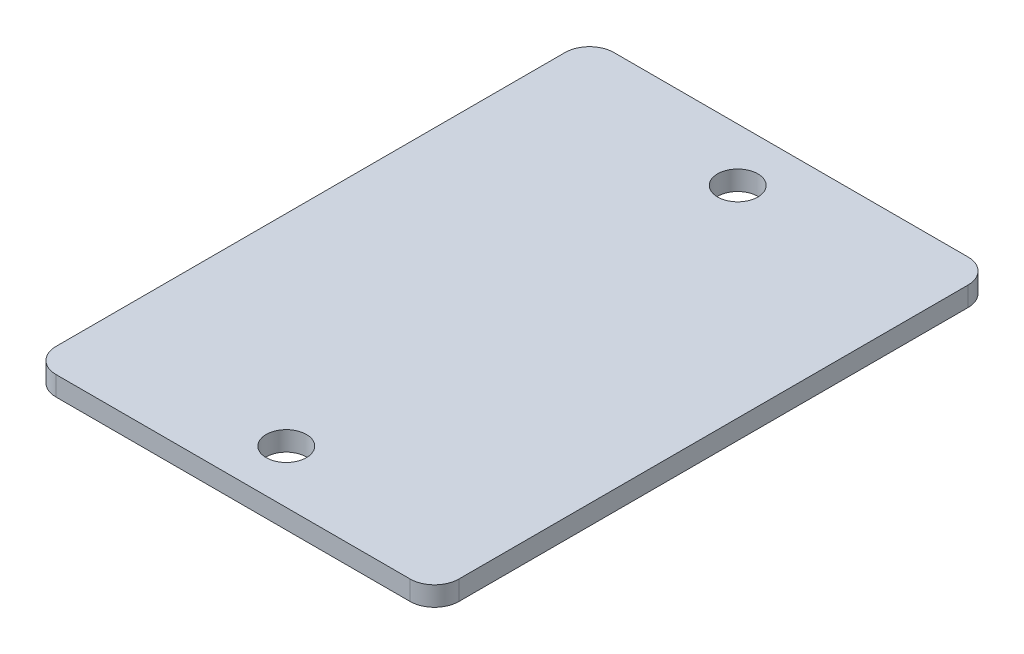
ISO-10303-21;
HEADER;
FILE_DESCRIPTION(('STEP AP214'),'2;1');
FILE_NAME('part.step','',(''),(''),'','','');
FILE_SCHEMA(('AUTOMOTIVE_DESIGN { 1 0 10303 214 1 1 1 1 }'));
ENDSEC;
DATA;
#1=APPLICATION_CONTEXT('core data for automotive mechanical design processes');
#2=APPLICATION_PROTOCOL_DEFINITION('international standard','automotive_design',2000,#1);
#3=PRODUCT_CONTEXT('',#1,'mechanical');
#4=PRODUCT('Part','Part','',(#3));
#5=PRODUCT_RELATED_PRODUCT_CATEGORY('part','',(#4));
#6=PRODUCT_DEFINITION_FORMATION('','',#4);
#7=PRODUCT_DEFINITION_CONTEXT('part definition',#1,'design');
#8=PRODUCT_DEFINITION('design','',#6,#7);
#9=PRODUCT_DEFINITION_SHAPE('','',#8);
#10=(LENGTH_UNIT() NAMED_UNIT(*) SI_UNIT(.MILLI.,.METRE.));
#11=(NAMED_UNIT(*) PLANE_ANGLE_UNIT() SI_UNIT($,.RADIAN.));
#12=(NAMED_UNIT(*) SI_UNIT($,.STERADIAN.) SOLID_ANGLE_UNIT());
#13=UNCERTAINTY_MEASURE_WITH_UNIT(LENGTH_MEASURE(1.E-05),#10,'distance_accuracy_value','');
#14=(GEOMETRIC_REPRESENTATION_CONTEXT(3) GLOBAL_UNCERTAINTY_ASSIGNED_CONTEXT((#13)) GLOBAL_UNIT_ASSIGNED_CONTEXT((#10,
#11,#12)) REPRESENTATION_CONTEXT('',''));
#15=CARTESIAN_POINT('',(0.,0.,0.));
#16=DIRECTION('',(0.,0.,1.));
#17=DIRECTION('',(1.,0.,0.));
#18=AXIS2_PLACEMENT_3D('',#15,#16,#17);
#19=CARTESIAN_POINT('',(0.,1.6,0.));
#20=DIRECTION('',(0.,1.,0.));
#21=DIRECTION('',(0.,0.,1.));
#22=AXIS2_PLACEMENT_3D('',#19,#20,#21);
#23=PLANE('',#22);
#24=CARTESIAN_POINT('',(0.,1.6,-18.5));
#25=DIRECTION('',(0.,1.,0.));
#26=DIRECTION('',(0.,0.,1.));
#27=AXIS2_PLACEMENT_3D('',#24,#25,#26);
#28=CIRCLE('',#27,1.65);
#29=CARTESIAN_POINT('',(0.,1.6,-16.85));
#30=VERTEX_POINT('',#29);
#31=EDGE_CURVE('E164',#30,#30,#28,.T.);
#32=ORIENTED_EDGE('',*,*,#31,.F.);
#33=EDGE_LOOP('',(#32));
#34=FACE_BOUND('',#33,.T.);
#35=DIRECTION('',(0.,0.,1.));
#36=VECTOR('',#35,1.);
#37=CARTESIAN_POINT('',(-16.51,1.6,-22.86));
#38=LINE('',#37,#36);
#39=CARTESIAN_POINT('',(-16.51,1.6,-20.86));
#40=VERTEX_POINT('',#39);
#41=CARTESIAN_POINT('',(-16.51,1.6,20.86));
#42=VERTEX_POINT('',#41);
#43=EDGE_CURVE('E171',#40,#42,#38,.T.);
#44=ORIENTED_EDGE('',*,*,#43,.T.);
#45=CARTESIAN_POINT('',(-14.51,1.6,20.86));
#46=DIRECTION('',(0.,1.,0.));
#47=DIRECTION('',(0.,0.,1.));
#48=AXIS2_PLACEMENT_3D('',#45,#46,#47);
#49=CIRCLE('',#48,2.);
#50=CARTESIAN_POINT('',(-14.51,1.6,22.86));
#51=VERTEX_POINT('',#50);
#52=EDGE_CURVE('E148',#42,#51,#49,.T.);
#53=ORIENTED_EDGE('',*,*,#52,.T.);
#54=DIRECTION('',(1.,0.,0.));
#55=VECTOR('',#54,1.);
#56=CARTESIAN_POINT('',(-16.51,1.6,22.86));
#57=LINE('',#56,#55);
#58=CARTESIAN_POINT('',(14.51,1.6,22.86));
#59=VERTEX_POINT('',#58);
#60=EDGE_CURVE('E119',#51,#59,#57,.T.);
#61=ORIENTED_EDGE('',*,*,#60,.T.);
#62=CARTESIAN_POINT('',(14.51,1.6,20.86));
#63=DIRECTION('',(0.,1.,0.));
#64=DIRECTION('',(0.,0.,1.));
#65=AXIS2_PLACEMENT_3D('',#62,#63,#64);
#66=CIRCLE('',#65,2.);
#67=CARTESIAN_POINT('',(16.51,1.6,20.86));
#68=VERTEX_POINT('',#67);
#69=EDGE_CURVE('E146',#59,#68,#66,.T.);
#70=ORIENTED_EDGE('',*,*,#69,.T.);
#71=DIRECTION('',(0.,0.,-1.));
#72=VECTOR('',#71,1.);
#73=CARTESIAN_POINT('',(16.51,1.6,-22.86));
#74=LINE('',#73,#72);
#75=CARTESIAN_POINT('',(16.51,1.6,-20.86));
#76=VERTEX_POINT('',#75);
#77=EDGE_CURVE('E126',#68,#76,#74,.T.);
#78=ORIENTED_EDGE('',*,*,#77,.T.);
#79=CARTESIAN_POINT('',(14.51,1.6,-20.86));
#80=DIRECTION('',(0.,1.,0.));
#81=DIRECTION('',(0.,0.,1.));
#82=AXIS2_PLACEMENT_3D('',#79,#80,#81);
#83=CIRCLE('',#82,2.);
#84=CARTESIAN_POINT('',(14.51,1.6,-22.86));
#85=VERTEX_POINT('',#84);
#86=EDGE_CURVE('E54',#76,#85,#83,.T.);
#87=ORIENTED_EDGE('',*,*,#86,.T.);
#88=DIRECTION('',(-1.,0.,0.));
#89=VECTOR('',#88,1.);
#90=CARTESIAN_POINT('',(-16.51,1.6,-22.86));
#91=LINE('',#90,#89);
#92=CARTESIAN_POINT('',(-14.51,1.6,-22.86));
#93=VERTEX_POINT('',#92);
#94=EDGE_CURVE('E129',#85,#93,#91,.T.);
#95=ORIENTED_EDGE('',*,*,#94,.T.);
#96=CARTESIAN_POINT('',(-14.51,1.6,-20.86));
#97=DIRECTION('',(0.,1.,0.));
#98=DIRECTION('',(0.,0.,1.));
#99=AXIS2_PLACEMENT_3D('',#96,#97,#98);
#100=CIRCLE('',#99,2.);
#101=EDGE_CURVE('E143',#93,#40,#100,.T.);
#102=ORIENTED_EDGE('',*,*,#101,.T.);
#103=EDGE_LOOP('',(#44,#53,#61,#70,#78,#87,#95,#102));
#104=FACE_BOUND('',#103,.T.);
#105=CARTESIAN_POINT('',(0.,1.6,18.5));
#106=DIRECTION('',(0.,1.,0.));
#107=DIRECTION('',(0.,0.,1.));
#108=AXIS2_PLACEMENT_3D('',#105,#106,#107);
#109=CIRCLE('',#108,1.65);
#110=CARTESIAN_POINT('',(0.,1.6,20.15));
#111=VERTEX_POINT('',#110);
#112=EDGE_CURVE('E176',#111,#111,#109,.T.);
#113=ORIENTED_EDGE('',*,*,#112,.F.);
#114=EDGE_LOOP('',(#113));
#115=FACE_BOUND('',#114,.T.);
#116=ADVANCED_FACE('F33',(#34,#104,#115),#23,.T.);
#117=CARTESIAN_POINT('',(0.,0.,0.));
#118=DIRECTION('',(0.,1.,0.));
#119=DIRECTION('',(0.,0.,1.));
#120=AXIS2_PLACEMENT_3D('',#117,#118,#119);
#121=PLANE('',#120);
#122=DIRECTION('',(1.,0.,0.));
#123=VECTOR('',#122,1.);
#124=CARTESIAN_POINT('',(-16.51,0.,22.86));
#125=LINE('',#124,#123);
#126=CARTESIAN_POINT('',(-14.51,0.,22.86));
#127=VERTEX_POINT('',#126);
#128=CARTESIAN_POINT('',(14.51,0.,22.86));
#129=VERTEX_POINT('',#128);
#130=EDGE_CURVE('E116',#127,#129,#125,.T.);
#131=ORIENTED_EDGE('',*,*,#130,.F.);
#132=CARTESIAN_POINT('',(-14.51,0.,20.86));
#133=DIRECTION('',(0.,1.,0.));
#134=DIRECTION('',(0.,0.,1.));
#135=AXIS2_PLACEMENT_3D('',#132,#133,#134);
#136=CIRCLE('',#135,2.);
#137=CARTESIAN_POINT('',(-16.51,0.,20.86));
#138=VERTEX_POINT('',#137);
#139=EDGE_CURVE('E99',#127,#138,#136,.F.);
#140=ORIENTED_EDGE('',*,*,#139,.T.);
#141=DIRECTION('',(0.,0.,1.));
#142=VECTOR('',#141,1.);
#143=CARTESIAN_POINT('',(-16.51,0.,-22.86));
#144=LINE('',#143,#142);
#145=CARTESIAN_POINT('',(-16.51,0.,-20.86));
#146=VERTEX_POINT('',#145);
#147=EDGE_CURVE('E127',#146,#138,#144,.T.);
#148=ORIENTED_EDGE('',*,*,#147,.F.);
#149=CARTESIAN_POINT('',(-14.51,0.,-20.86));
#150=DIRECTION('',(0.,1.,0.));
#151=DIRECTION('',(0.,0.,1.));
#152=AXIS2_PLACEMENT_3D('',#149,#150,#151);
#153=CIRCLE('',#152,2.);
#154=CARTESIAN_POINT('',(-14.51,0.,-22.86));
#155=VERTEX_POINT('',#154);
#156=EDGE_CURVE('E120',#146,#155,#153,.F.);
#157=ORIENTED_EDGE('',*,*,#156,.T.);
#158=DIRECTION('',(-1.,0.,0.));
#159=VECTOR('',#158,1.);
#160=CARTESIAN_POINT('',(-16.51,0.,-22.86));
#161=LINE('',#160,#159);
#162=CARTESIAN_POINT('',(14.51,0.,-22.86));
#163=VERTEX_POINT('',#162);
#164=EDGE_CURVE('E131',#163,#155,#161,.T.);
#165=ORIENTED_EDGE('',*,*,#164,.F.);
#166=CARTESIAN_POINT('',(14.51,0.,-20.86));
#167=DIRECTION('',(0.,1.,0.));
#168=DIRECTION('',(0.,0.,1.));
#169=AXIS2_PLACEMENT_3D('',#166,#167,#168);
#170=CIRCLE('',#169,2.);
#171=CARTESIAN_POINT('',(16.51,0.,-20.86));
#172=VERTEX_POINT('',#171);
#173=EDGE_CURVE('E137',#163,#172,#170,.F.);
#174=ORIENTED_EDGE('',*,*,#173,.T.);
#175=DIRECTION('',(0.,0.,-1.));
#176=VECTOR('',#175,1.);
#177=CARTESIAN_POINT('',(16.51,0.,-22.86));
#178=LINE('',#177,#176);
#179=CARTESIAN_POINT('',(16.51,0.,20.86));
#180=VERTEX_POINT('',#179);
#181=EDGE_CURVE('E159',#180,#172,#178,.T.);
#182=ORIENTED_EDGE('',*,*,#181,.F.);
#183=CARTESIAN_POINT('',(14.51,0.,20.86));
#184=DIRECTION('',(0.,1.,0.));
#185=DIRECTION('',(0.,0.,1.));
#186=AXIS2_PLACEMENT_3D('',#183,#184,#185);
#187=CIRCLE('',#186,2.);
#188=EDGE_CURVE('E110',#180,#129,#187,.F.);
#189=ORIENTED_EDGE('',*,*,#188,.T.);
#190=EDGE_LOOP('',(#131,#140,#148,#157,#165,#174,#182,#189));
#191=FACE_BOUND('',#190,.T.);
#192=CARTESIAN_POINT('',(0.,0.,-18.5));
#193=DIRECTION('',(0.,1.,0.));
#194=DIRECTION('',(0.,0.,1.));
#195=AXIS2_PLACEMENT_3D('',#192,#193,#194);
#196=CIRCLE('',#195,1.65);
#197=CARTESIAN_POINT('',(0.,0.,-16.85));
#198=VERTEX_POINT('',#197);
#199=EDGE_CURVE('E167',#198,#198,#196,.T.);
#200=ORIENTED_EDGE('',*,*,#199,.T.);
#201=EDGE_LOOP('',(#200));
#202=FACE_BOUND('',#201,.T.);
#203=CARTESIAN_POINT('',(0.,0.,18.5));
#204=DIRECTION('',(0.,1.,0.));
#205=DIRECTION('',(0.,0.,1.));
#206=AXIS2_PLACEMENT_3D('',#203,#204,#205);
#207=CIRCLE('',#206,1.65);
#208=CARTESIAN_POINT('',(0.,0.,20.15));
#209=VERTEX_POINT('',#208);
#210=EDGE_CURVE('E178',#209,#209,#207,.T.);
#211=ORIENTED_EDGE('',*,*,#210,.T.);
#212=EDGE_LOOP('',(#211));
#213=FACE_BOUND('',#212,.T.);
#214=ADVANCED_FACE('F123',(#191,#202,#213),#121,.F.);
#215=CARTESIAN_POINT('',(16.51,1.6,-22.86));
#216=DIRECTION('',(-1.,0.,0.));
#217=DIRECTION('',(0.,0.,1.));
#218=AXIS2_PLACEMENT_3D('',#215,#216,#217);
#219=PLANE('',#218);
#220=ORIENTED_EDGE('',*,*,#77,.F.);
#221=DIRECTION('',(0.,-1.,0.));
#222=VECTOR('',#221,1.);
#223=CARTESIAN_POINT('',(16.51,1.6,20.86));
#224=LINE('',#223,#222);
#225=EDGE_CURVE('E152',#68,#180,#224,.T.);
#226=ORIENTED_EDGE('',*,*,#225,.T.);
#227=ORIENTED_EDGE('',*,*,#181,.T.);
#228=DIRECTION('',(0.,-1.,0.));
#229=VECTOR('',#228,1.);
#230=CARTESIAN_POINT('',(16.51,1.6,-20.86));
#231=LINE('',#230,#229);
#232=EDGE_CURVE('E150',#172,#76,#231,.F.);
#233=ORIENTED_EDGE('',*,*,#232,.T.);
#234=EDGE_LOOP('',(#220,#226,#227,#233));
#235=FACE_BOUND('',#234,.T.);
#236=ADVANCED_FACE('F158',(#235),#219,.F.);
#237=CARTESIAN_POINT('',(-16.51,1.6,-22.86));
#238=DIRECTION('',(0.,0.,1.));
#239=DIRECTION('',(1.,0.,0.));
#240=AXIS2_PLACEMENT_3D('',#237,#238,#239);
#241=PLANE('',#240);
#242=ORIENTED_EDGE('',*,*,#94,.F.);
#243=DIRECTION('',(0.,-1.,0.));
#244=VECTOR('',#243,1.);
#245=CARTESIAN_POINT('',(14.51,1.6,-22.86));
#246=LINE('',#245,#244);
#247=EDGE_CURVE('E11',#85,#163,#246,.T.);
#248=ORIENTED_EDGE('',*,*,#247,.T.);
#249=ORIENTED_EDGE('',*,*,#164,.T.);
#250=DIRECTION('',(0.,-1.,0.));
#251=VECTOR('',#250,1.);
#252=CARTESIAN_POINT('',(-14.51,1.6,-22.86));
#253=LINE('',#252,#251);
#254=EDGE_CURVE('E41',#155,#93,#253,.F.);
#255=ORIENTED_EDGE('',*,*,#254,.T.);
#256=EDGE_LOOP('',(#242,#248,#249,#255));
#257=FACE_BOUND('',#256,.T.);
#258=ADVANCED_FACE('F204',(#257),#241,.F.);
#259=CARTESIAN_POINT('',(-16.51,1.6,-22.86));
#260=DIRECTION('',(1.,0.,0.));
#261=DIRECTION('',(0.,0.,-1.));
#262=AXIS2_PLACEMENT_3D('',#259,#260,#261);
#263=PLANE('',#262);
#264=ORIENTED_EDGE('',*,*,#147,.T.);
#265=DIRECTION('',(0.,-1.,0.));
#266=VECTOR('',#265,1.);
#267=CARTESIAN_POINT('',(-16.51,1.6,20.86));
#268=LINE('',#267,#266);
#269=EDGE_CURVE('E104',#138,#42,#268,.F.);
#270=ORIENTED_EDGE('',*,*,#269,.T.);
#271=ORIENTED_EDGE('',*,*,#43,.F.);
#272=DIRECTION('',(0.,-1.,0.));
#273=VECTOR('',#272,1.);
#274=CARTESIAN_POINT('',(-16.51,1.6,-20.86));
#275=LINE('',#274,#273);
#276=EDGE_CURVE('E109',#40,#146,#275,.T.);
#277=ORIENTED_EDGE('',*,*,#276,.T.);
#278=EDGE_LOOP('',(#264,#270,#271,#277));
#279=FACE_BOUND('',#278,.T.);
#280=ADVANCED_FACE('F201',(#279),#263,.F.);
#281=CARTESIAN_POINT('',(-16.51,1.6,22.86));
#282=DIRECTION('',(0.,0.,-1.));
#283=DIRECTION('',(-1.,0.,0.));
#284=AXIS2_PLACEMENT_3D('',#281,#282,#283);
#285=PLANE('',#284);
#286=ORIENTED_EDGE('',*,*,#60,.F.);
#287=DIRECTION('',(0.,-1.,0.));
#288=VECTOR('',#287,1.);
#289=CARTESIAN_POINT('',(-14.51,1.6,22.86));
#290=LINE('',#289,#288);
#291=EDGE_CURVE('E103',#51,#127,#290,.T.);
#292=ORIENTED_EDGE('',*,*,#291,.T.);
#293=ORIENTED_EDGE('',*,*,#130,.T.);
#294=DIRECTION('',(0.,-1.,0.));
#295=VECTOR('',#294,1.);
#296=CARTESIAN_POINT('',(14.51,1.6,22.86));
#297=LINE('',#296,#295);
#298=EDGE_CURVE('E121',#129,#59,#297,.F.);
#299=ORIENTED_EDGE('',*,*,#298,.T.);
#300=EDGE_LOOP('',(#286,#292,#293,#299));
#301=FACE_BOUND('',#300,.T.);
#302=ADVANCED_FACE('F115',(#301),#285,.F.);
#303=CARTESIAN_POINT('',(0.,1.6,-18.5));
#304=DIRECTION('',(0.,-1.,0.));
#305=DIRECTION('',(0.,0.,-1.));
#306=AXIS2_PLACEMENT_3D('',#303,#304,#305);
#307=CYLINDRICAL_SURFACE('',#306,1.65);
#308=ORIENTED_EDGE('',*,*,#31,.T.);
#309=EDGE_LOOP('',(#308));
#310=FACE_BOUND('',#309,.T.);
#311=ORIENTED_EDGE('',*,*,#199,.F.);
#312=EDGE_LOOP('',(#311));
#313=FACE_BOUND('',#312,.T.);
#314=ADVANCED_FACE('F196',(#310,#313),#307,.F.);
#315=CARTESIAN_POINT('',(0.,1.6,18.5));
#316=DIRECTION('',(0.,-1.,0.));
#317=DIRECTION('',(0.,0.,-1.));
#318=AXIS2_PLACEMENT_3D('',#315,#316,#317);
#319=CYLINDRICAL_SURFACE('',#318,1.65);
#320=ORIENTED_EDGE('',*,*,#112,.T.);
#321=EDGE_LOOP('',(#320));
#322=FACE_BOUND('',#321,.T.);
#323=ORIENTED_EDGE('',*,*,#210,.F.);
#324=EDGE_LOOP('',(#323));
#325=FACE_BOUND('',#324,.T.);
#326=ADVANCED_FACE('F184',(#322,#325),#319,.F.);
#327=CARTESIAN_POINT('',(-14.51,1.6,20.86));
#328=DIRECTION('',(0.,-1.,0.));
#329=DIRECTION('',(0.,0.,-1.));
#330=AXIS2_PLACEMENT_3D('',#327,#328,#329);
#331=CYLINDRICAL_SURFACE('',#330,2.);
#332=ORIENTED_EDGE('',*,*,#52,.F.);
#333=ORIENTED_EDGE('',*,*,#269,.F.);
#334=ORIENTED_EDGE('',*,*,#139,.F.);
#335=ORIENTED_EDGE('',*,*,#291,.F.);
#336=EDGE_LOOP('',(#332,#333,#334,#335));
#337=FACE_BOUND('',#336,.T.);
#338=ADVANCED_FACE('F102',(#337),#331,.T.);
#339=CARTESIAN_POINT('',(14.51,1.6,20.86));
#340=DIRECTION('',(0.,-1.,0.));
#341=DIRECTION('',(0.,0.,-1.));
#342=AXIS2_PLACEMENT_3D('',#339,#340,#341);
#343=CYLINDRICAL_SURFACE('',#342,2.);
#344=ORIENTED_EDGE('',*,*,#69,.F.);
#345=ORIENTED_EDGE('',*,*,#298,.F.);
#346=ORIENTED_EDGE('',*,*,#188,.F.);
#347=ORIENTED_EDGE('',*,*,#225,.F.);
#348=EDGE_LOOP('',(#344,#345,#346,#347));
#349=FACE_BOUND('',#348,.T.);
#350=ADVANCED_FACE('F212',(#349),#343,.T.);
#351=CARTESIAN_POINT('',(14.51,1.6,-20.86));
#352=DIRECTION('',(0.,-1.,0.));
#353=DIRECTION('',(0.,0.,-1.));
#354=AXIS2_PLACEMENT_3D('',#351,#352,#353);
#355=CYLINDRICAL_SURFACE('',#354,2.);
#356=ORIENTED_EDGE('',*,*,#86,.F.);
#357=ORIENTED_EDGE('',*,*,#232,.F.);
#358=ORIENTED_EDGE('',*,*,#173,.F.);
#359=ORIENTED_EDGE('',*,*,#247,.F.);
#360=EDGE_LOOP('',(#356,#357,#358,#359));
#361=FACE_BOUND('',#360,.T.);
#362=ADVANCED_FACE('F214',(#361),#355,.T.);
#363=CARTESIAN_POINT('',(-14.51,1.6,-20.86));
#364=DIRECTION('',(0.,-1.,0.));
#365=DIRECTION('',(0.,0.,-1.));
#366=AXIS2_PLACEMENT_3D('',#363,#364,#365);
#367=CYLINDRICAL_SURFACE('',#366,2.);
#368=ORIENTED_EDGE('',*,*,#101,.F.);
#369=ORIENTED_EDGE('',*,*,#254,.F.);
#370=ORIENTED_EDGE('',*,*,#156,.F.);
#371=ORIENTED_EDGE('',*,*,#276,.F.);
#372=EDGE_LOOP('',(#368,#369,#370,#371));
#373=FACE_BOUND('',#372,.T.);
#374=ADVANCED_FACE('F35',(#373),#367,.T.);
#375=CLOSED_SHELL('',(#116,#214,#236,#258,#280,#302,#314,#326,#338,#350,#362,#374));
#376=MANIFOLD_SOLID_BREP('B2',#375);
#377=ADVANCED_BREP_SHAPE_REPRESENTATION('',(#18,#376),#14);
#378=SHAPE_DEFINITION_REPRESENTATION(#9,#377);
ENDSEC;
END-ISO-10303-21;
